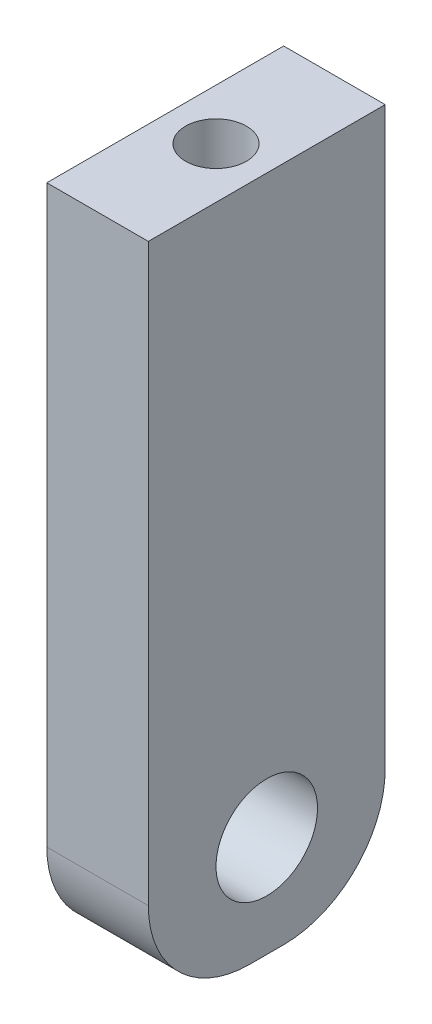
ISO-10303-21;
HEADER;
FILE_DESCRIPTION(('STEP AP214'),'2;1');
FILE_NAME('part.step','',(''),(''),'','','');
FILE_SCHEMA(('AUTOMOTIVE_DESIGN { 1 0 10303 214 1 1 1 1 }'));
ENDSEC;
DATA;
#1=APPLICATION_CONTEXT('core data for automotive mechanical design processes');
#2=APPLICATION_PROTOCOL_DEFINITION('international standard','automotive_design',2000,#1);
#3=PRODUCT_CONTEXT('',#1,'mechanical');
#4=PRODUCT('Part','Part','',(#3));
#5=PRODUCT_RELATED_PRODUCT_CATEGORY('part','',(#4));
#6=PRODUCT_DEFINITION_FORMATION('','',#4);
#7=PRODUCT_DEFINITION_CONTEXT('part definition',#1,'design');
#8=PRODUCT_DEFINITION('design','',#6,#7);
#9=PRODUCT_DEFINITION_SHAPE('','',#8);
#10=(LENGTH_UNIT() NAMED_UNIT(*) SI_UNIT(.MILLI.,.METRE.));
#11=(NAMED_UNIT(*) PLANE_ANGLE_UNIT() SI_UNIT($,.RADIAN.));
#12=(NAMED_UNIT(*) SI_UNIT($,.STERADIAN.) SOLID_ANGLE_UNIT());
#13=UNCERTAINTY_MEASURE_WITH_UNIT(LENGTH_MEASURE(1.E-05),#10,'distance_accuracy_value','');
#14=(GEOMETRIC_REPRESENTATION_CONTEXT(3) GLOBAL_UNCERTAINTY_ASSIGNED_CONTEXT((#13)) GLOBAL_UNIT_ASSIGNED_CONTEXT((#10,
#11,#12)) REPRESENTATION_CONTEXT('',''));
#15=CARTESIAN_POINT('',(0.,0.,0.));
#16=DIRECTION('',(0.,0.,1.));
#17=DIRECTION('',(1.,0.,0.));
#18=AXIS2_PLACEMENT_3D('',#15,#16,#17);
#19=CARTESIAN_POINT('',(3.,0.546254549383258,7.));
#20=DIRECTION('',(0.,-1.,0.));
#21=DIRECTION('',(1.,0.,0.));
#22=AXIS2_PLACEMENT_3D('',#19,#20,#21);
#23=PLANE('',#22);
#24=CARTESIAN_POINT('',(1.5,0.546254549383257,3.5));
#25=DIRECTION('',(0.,1.,0.));
#26=DIRECTION('',(-1.,0.,0.));
#27=AXIS2_PLACEMENT_3D('',#24,#25,#26);
#28=CIRCLE('',#27,0.9);
#29=CARTESIAN_POINT('',(0.6,0.546254549383257,3.5));
#30=VERTEX_POINT('',#29);
#31=EDGE_CURVE('E193',#30,#30,#28,.T.);
#32=ORIENTED_EDGE('',*,*,#31,.F.);
#33=EDGE_LOOP('',(#32));
#34=FACE_BOUND('',#33,.T.);
#35=DIRECTION('',(-1.,0.,0.));
#36=VECTOR('',#35,1.);
#37=CARTESIAN_POINT('',(3.,0.546254549383258,0.));
#38=LINE('',#37,#36);
#39=CARTESIAN_POINT('',(3.,0.546254549383258,0.));
#40=VERTEX_POINT('',#39);
#41=CARTESIAN_POINT('',(0.,0.546254549383257,0.));
#42=VERTEX_POINT('',#41);
#43=EDGE_CURVE('E115',#40,#42,#38,.T.);
#44=ORIENTED_EDGE('',*,*,#43,.T.);
#45=DIRECTION('',(0.,0.,-1.));
#46=VECTOR('',#45,1.);
#47=CARTESIAN_POINT('',(0.,0.546254549383257,7.));
#48=LINE('',#47,#46);
#49=CARTESIAN_POINT('',(0.,0.546254549383257,7.));
#50=VERTEX_POINT('',#49);
#51=EDGE_CURVE('E97',#50,#42,#48,.T.);
#52=ORIENTED_EDGE('',*,*,#51,.F.);
#53=DIRECTION('',(-1.,0.,0.));
#54=VECTOR('',#53,1.);
#55=CARTESIAN_POINT('',(3.,0.546254549383258,7.));
#56=LINE('',#55,#54);
#57=CARTESIAN_POINT('',(3.,0.546254549383258,7.));
#58=VERTEX_POINT('',#57);
#59=EDGE_CURVE('E104',#58,#50,#56,.T.);
#60=ORIENTED_EDGE('',*,*,#59,.F.);
#61=DIRECTION('',(0.,0.,-1.));
#62=VECTOR('',#61,1.);
#63=CARTESIAN_POINT('',(3.,0.546254549383258,7.));
#64=LINE('',#63,#62);
#65=EDGE_CURVE('E143',#58,#40,#64,.T.);
#66=ORIENTED_EDGE('',*,*,#65,.T.);
#67=EDGE_LOOP('',(#44,#52,#60,#66));
#68=FACE_BOUND('',#67,.T.);
#69=ADVANCED_FACE('F41',(#34,#68),#23,.F.);
#70=CARTESIAN_POINT('',(0.,0.546254549383257,7.));
#71=DIRECTION('',(1.,0.,0.));
#72=DIRECTION('',(0.,1.,0.));
#73=AXIS2_PLACEMENT_3D('',#70,#71,#72);
#74=PLANE('',#73);
#75=CARTESIAN_POINT('',(0.,-16.4537454506167,3.5));
#76=DIRECTION('',(1.,0.,0.));
#77=DIRECTION('',(0.,0.,-1.));
#78=AXIS2_PLACEMENT_3D('',#75,#76,#77);
#79=CIRCLE('',#78,1.5);
#80=CARTESIAN_POINT('',(0.,-16.4537454506167,2.));
#81=VERTEX_POINT('',#80);
#82=EDGE_CURVE('E149',#81,#81,#79,.T.);
#83=ORIENTED_EDGE('',*,*,#82,.T.);
#84=EDGE_LOOP('',(#83));
#85=FACE_BOUND('',#84,.T.);
#86=DIRECTION('',(0.,0.,-1.));
#87=VECTOR('',#86,1.);
#88=CARTESIAN_POINT('',(0.,-19.4537454506167,7.));
#89=LINE('',#88,#87);
#90=CARTESIAN_POINT('',(0.,-19.4537454506167,4.));
#91=VERTEX_POINT('',#90);
#92=CARTESIAN_POINT('',(0.,-19.4537454506167,3.));
#93=VERTEX_POINT('',#92);
#94=EDGE_CURVE('E117',#91,#93,#89,.T.);
#95=ORIENTED_EDGE('',*,*,#94,.F.);
#96=CARTESIAN_POINT('',(0.,-16.4537454506167,4.));
#97=DIRECTION('',(1.,0.,0.));
#98=DIRECTION('',(0.,1.,0.));
#99=AXIS2_PLACEMENT_3D('',#96,#97,#98);
#100=CIRCLE('',#99,3.);
#101=CARTESIAN_POINT('',(0.,-16.4537454506167,7.));
#102=VERTEX_POINT('',#101);
#103=EDGE_CURVE('E49',#91,#102,#100,.F.);
#104=ORIENTED_EDGE('',*,*,#103,.T.);
#105=DIRECTION('',(0.,-1.,0.));
#106=VECTOR('',#105,1.);
#107=CARTESIAN_POINT('',(0.,0.546254549383257,7.));
#108=LINE('',#107,#106);
#109=EDGE_CURVE('E93',#50,#102,#108,.T.);
#110=ORIENTED_EDGE('',*,*,#109,.F.);
#111=ORIENTED_EDGE('',*,*,#51,.T.);
#112=DIRECTION('',(0.,-1.,0.));
#113=VECTOR('',#112,1.);
#114=CARTESIAN_POINT('',(0.,0.546254549383257,0.));
#115=LINE('',#114,#113);
#116=CARTESIAN_POINT('',(0.,-16.4537454506167,0.));
#117=VERTEX_POINT('',#116);
#118=EDGE_CURVE('E148',#42,#117,#115,.T.);
#119=ORIENTED_EDGE('',*,*,#118,.T.);
#120=CARTESIAN_POINT('',(0.,-16.4537454506167,3.));
#121=DIRECTION('',(1.,0.,0.));
#122=DIRECTION('',(0.,1.,0.));
#123=AXIS2_PLACEMENT_3D('',#120,#121,#122);
#124=CIRCLE('',#123,3.);
#125=EDGE_CURVE('E61',#117,#93,#124,.F.);
#126=ORIENTED_EDGE('',*,*,#125,.T.);
#127=EDGE_LOOP('',(#95,#104,#110,#111,#119,#126));
#128=FACE_BOUND('',#127,.T.);
#129=ADVANCED_FACE('F95',(#85,#128),#74,.F.);
#130=CARTESIAN_POINT('',(0.,-19.4537454506167,7.));
#131=DIRECTION('',(0.,1.,0.));
#132=DIRECTION('',(0.,0.,1.));
#133=AXIS2_PLACEMENT_3D('',#130,#131,#132);
#134=PLANE('',#133);
#135=DIRECTION('',(0.,0.,-1.));
#136=VECTOR('',#135,1.);
#137=CARTESIAN_POINT('',(3.,-19.4537454506167,7.));
#138=LINE('',#137,#136);
#139=CARTESIAN_POINT('',(3.,-19.4537454506167,4.));
#140=VERTEX_POINT('',#139);
#141=CARTESIAN_POINT('',(3.,-19.4537454506167,3.));
#142=VERTEX_POINT('',#141);
#143=EDGE_CURVE('E121',#140,#142,#138,.T.);
#144=ORIENTED_EDGE('',*,*,#143,.F.);
#145=DIRECTION('',(1.,0.,0.));
#146=VECTOR('',#145,1.);
#147=CARTESIAN_POINT('',(0.,-19.4537454506167,4.));
#148=LINE('',#147,#146);
#149=EDGE_CURVE('E131',#140,#91,#148,.F.);
#150=ORIENTED_EDGE('',*,*,#149,.T.);
#151=ORIENTED_EDGE('',*,*,#94,.T.);
#152=DIRECTION('',(1.,0.,0.));
#153=VECTOR('',#152,1.);
#154=CARTESIAN_POINT('',(0.,-19.4537454506167,3.));
#155=LINE('',#154,#153);
#156=EDGE_CURVE('E128',#93,#142,#155,.T.);
#157=ORIENTED_EDGE('',*,*,#156,.T.);
#158=EDGE_LOOP('',(#144,#150,#151,#157));
#159=FACE_BOUND('',#158,.T.);
#160=ADVANCED_FACE('F136',(#159),#134,.F.);
#161=CARTESIAN_POINT('',(3.,-19.4537454506167,7.));
#162=DIRECTION('',(-1.,0.,0.));
#163=DIRECTION('',(0.,0.,1.));
#164=AXIS2_PLACEMENT_3D('',#161,#162,#163);
#165=PLANE('',#164);
#166=CARTESIAN_POINT('',(3.,-16.4537454506167,3.5));
#167=DIRECTION('',(1.,0.,0.));
#168=DIRECTION('',(0.,0.,-1.));
#169=AXIS2_PLACEMENT_3D('',#166,#167,#168);
#170=CIRCLE('',#169,1.5);
#171=CARTESIAN_POINT('',(3.,-16.4537454506167,2.));
#172=VERTEX_POINT('',#171);
#173=EDGE_CURVE('E192',#172,#172,#170,.T.);
#174=ORIENTED_EDGE('',*,*,#173,.F.);
#175=EDGE_LOOP('',(#174));
#176=FACE_BOUND('',#175,.T.);
#177=DIRECTION('',(0.,1.,0.));
#178=VECTOR('',#177,1.);
#179=CARTESIAN_POINT('',(3.,-19.4537454506167,7.));
#180=LINE('',#179,#178);
#181=CARTESIAN_POINT('',(3.,-16.4537454506167,7.));
#182=VERTEX_POINT('',#181);
#183=EDGE_CURVE('E103',#182,#58,#180,.T.);
#184=ORIENTED_EDGE('',*,*,#183,.F.);
#185=CARTESIAN_POINT('',(3.,-16.4537454506167,4.));
#186=DIRECTION('',(-1.,0.,0.));
#187=DIRECTION('',(0.,0.,1.));
#188=AXIS2_PLACEMENT_3D('',#185,#186,#187);
#189=CIRCLE('',#188,3.);
#190=EDGE_CURVE('E126',#182,#140,#189,.F.);
#191=ORIENTED_EDGE('',*,*,#190,.T.);
#192=ORIENTED_EDGE('',*,*,#143,.T.);
#193=CARTESIAN_POINT('',(3.,-16.4537454506167,3.));
#194=DIRECTION('',(-1.,0.,0.));
#195=DIRECTION('',(0.,0.,1.));
#196=AXIS2_PLACEMENT_3D('',#193,#194,#195);
#197=CIRCLE('',#196,3.);
#198=CARTESIAN_POINT('',(3.,-16.4537454506167,0.));
#199=VERTEX_POINT('',#198);
#200=EDGE_CURVE('E119',#142,#199,#197,.F.);
#201=ORIENTED_EDGE('',*,*,#200,.T.);
#202=DIRECTION('',(0.,1.,0.));
#203=VECTOR('',#202,1.);
#204=CARTESIAN_POINT('',(3.,-19.4537454506167,0.));
#205=LINE('',#204,#203);
#206=EDGE_CURVE('E112',#199,#40,#205,.T.);
#207=ORIENTED_EDGE('',*,*,#206,.T.);
#208=ORIENTED_EDGE('',*,*,#65,.F.);
#209=EDGE_LOOP('',(#184,#191,#192,#201,#207,#208));
#210=FACE_BOUND('',#209,.T.);
#211=ADVANCED_FACE('F142',(#176,#210),#165,.F.);
#212=CARTESIAN_POINT('',(0.,0.,7.));
#213=DIRECTION('',(0.,0.,1.));
#214=DIRECTION('',(1.,0.,0.));
#215=AXIS2_PLACEMENT_3D('',#212,#213,#214);
#216=PLANE('',#215);
#217=ORIENTED_EDGE('',*,*,#109,.T.);
#218=DIRECTION('',(1.,0.,0.));
#219=VECTOR('',#218,1.);
#220=CARTESIAN_POINT('',(3.,-16.4537454506167,7.));
#221=LINE('',#220,#219);
#222=EDGE_CURVE('E116',#102,#182,#221,.T.);
#223=ORIENTED_EDGE('',*,*,#222,.T.);
#224=ORIENTED_EDGE('',*,*,#183,.T.);
#225=ORIENTED_EDGE('',*,*,#59,.T.);
#226=EDGE_LOOP('',(#217,#223,#224,#225));
#227=FACE_BOUND('',#226,.T.);
#228=ADVANCED_FACE('F107',(#227),#216,.T.);
#229=CARTESIAN_POINT('',(0.,0.,0.));
#230=DIRECTION('',(0.,0.,1.));
#231=DIRECTION('',(1.,0.,0.));
#232=AXIS2_PLACEMENT_3D('',#229,#230,#231);
#233=PLANE('',#232);
#234=ORIENTED_EDGE('',*,*,#206,.F.);
#235=DIRECTION('',(1.,0.,0.));
#236=VECTOR('',#235,1.);
#237=CARTESIAN_POINT('',(0.,-16.4537454506167,0.));
#238=LINE('',#237,#236);
#239=EDGE_CURVE('E11',#199,#117,#238,.F.);
#240=ORIENTED_EDGE('',*,*,#239,.T.);
#241=ORIENTED_EDGE('',*,*,#118,.F.);
#242=ORIENTED_EDGE('',*,*,#43,.F.);
#243=EDGE_LOOP('',(#234,#240,#241,#242));
#244=FACE_BOUND('',#243,.T.);
#245=ADVANCED_FACE('F152',(#244),#233,.F.);
#246=CARTESIAN_POINT('',(0.,-16.4537454506167,3.5));
#247=DIRECTION('',(1.,0.,0.));
#248=DIRECTION('',(0.,0.,-1.));
#249=AXIS2_PLACEMENT_3D('',#246,#247,#248);
#250=CYLINDRICAL_SURFACE('',#249,1.5);
#251=CARTESIAN_POINT('',(0.,-16.4537454506167,2.));
#252=CARTESIAN_POINT('',(0.0312499999999995,-16.4537454506167,2.));
#253=CARTESIAN_POINT('',(0.0624999999999996,-16.4537454506167,2.));
#254=CARTESIAN_POINT('',(0.125,-16.4537454506167,2.));
#255=CARTESIAN_POINT('',(0.15625,-16.4537454506167,2.));
#256=CARTESIAN_POINT('',(0.21875,-16.4537454506167,2.));
#257=CARTESIAN_POINT('',(0.25,-16.4537454506167,2.));
#258=CARTESIAN_POINT('',(0.3125,-16.4537454506167,2.));
#259=CARTESIAN_POINT('',(0.34375,-16.4537454506167,2.));
#260=CARTESIAN_POINT('',(0.40625,-16.4537454506167,2.));
#261=CARTESIAN_POINT('',(0.4375,-16.4537454506167,2.));
#262=CARTESIAN_POINT('',(0.5,-16.4537454506167,2.));
#263=CARTESIAN_POINT('',(0.53125,-16.4537454506167,2.));
#264=CARTESIAN_POINT('',(0.59375,-16.4537454506167,2.));
#265=CARTESIAN_POINT('',(0.625,-16.4537454506167,2.));
#266=CARTESIAN_POINT('',(0.6875,-16.4537454506167,2.));
#267=CARTESIAN_POINT('',(0.71875,-16.4537454506167,2.));
#268=CARTESIAN_POINT('',(0.78125,-16.4537454506167,2.));
#269=CARTESIAN_POINT('',(0.8125,-16.4537454506167,2.));
#270=CARTESIAN_POINT('',(0.875,-16.4537454506167,2.));
#271=CARTESIAN_POINT('',(0.90625,-16.4537454506167,2.));
#272=CARTESIAN_POINT('',(0.96875,-16.4537454506167,2.));
#273=CARTESIAN_POINT('',(1.,-16.4537454506167,2.));
#274=CARTESIAN_POINT('',(1.0625,-16.4537454506167,2.));
#275=CARTESIAN_POINT('',(1.09375,-16.4537454506167,2.));
#276=CARTESIAN_POINT('',(1.15625,-16.4537454506167,2.));
#277=CARTESIAN_POINT('',(1.1875,-16.4537454506167,2.));
#278=CARTESIAN_POINT('',(1.25,-16.4537454506167,2.));
#279=CARTESIAN_POINT('',(1.28125,-16.4537454506167,2.));
#280=CARTESIAN_POINT('',(1.34375,-16.4537454506167,2.));
#281=CARTESIAN_POINT('',(1.375,-16.4537454506167,2.));
#282=CARTESIAN_POINT('',(1.4375,-16.4537454506167,2.));
#283=CARTESIAN_POINT('',(1.46875,-16.4537454506167,2.));
#284=CARTESIAN_POINT('',(1.53125,-16.4537454506167,2.));
#285=CARTESIAN_POINT('',(1.5625,-16.4537454506167,2.));
#286=CARTESIAN_POINT('',(1.625,-16.4537454506167,2.));
#287=CARTESIAN_POINT('',(1.65625,-16.4537454506167,2.));
#288=CARTESIAN_POINT('',(1.71875,-16.4537454506167,2.));
#289=CARTESIAN_POINT('',(1.75,-16.4537454506167,2.));
#290=CARTESIAN_POINT('',(1.8125,-16.4537454506167,2.));
#291=CARTESIAN_POINT('',(1.84375,-16.4537454506167,2.));
#292=CARTESIAN_POINT('',(1.90625,-16.4537454506167,2.));
#293=CARTESIAN_POINT('',(1.9375,-16.4537454506167,2.));
#294=CARTESIAN_POINT('',(2.,-16.4537454506167,2.));
#295=CARTESIAN_POINT('',(2.03125,-16.4537454506167,2.));
#296=CARTESIAN_POINT('',(2.09375,-16.4537454506167,2.));
#297=CARTESIAN_POINT('',(2.125,-16.4537454506167,2.));
#298=CARTESIAN_POINT('',(2.1875,-16.4537454506167,2.));
#299=CARTESIAN_POINT('',(2.21875,-16.4537454506167,2.));
#300=CARTESIAN_POINT('',(2.28125,-16.4537454506167,2.));
#301=CARTESIAN_POINT('',(2.3125,-16.4537454506167,2.));
#302=CARTESIAN_POINT('',(2.375,-16.4537454506167,2.));
#303=CARTESIAN_POINT('',(2.40625,-16.4537454506167,2.));
#304=CARTESIAN_POINT('',(2.46875,-16.4537454506167,2.));
#305=CARTESIAN_POINT('',(2.5,-16.4537454506167,2.));
#306=CARTESIAN_POINT('',(2.5625,-16.4537454506167,2.));
#307=CARTESIAN_POINT('',(2.59375,-16.4537454506167,2.));
#308=CARTESIAN_POINT('',(2.65625,-16.4537454506167,2.));
#309=CARTESIAN_POINT('',(2.6875,-16.4537454506167,2.));
#310=CARTESIAN_POINT('',(2.75,-16.4537454506167,2.));
#311=CARTESIAN_POINT('',(2.78125,-16.4537454506167,2.));
#312=CARTESIAN_POINT('',(2.84375,-16.4537454506167,2.));
#313=CARTESIAN_POINT('',(2.875,-16.4537454506167,2.));
#314=CARTESIAN_POINT('',(2.9375,-16.4537454506167,2.));
#315=CARTESIAN_POINT('',(2.96875,-16.4537454506167,2.));
#316=CARTESIAN_POINT('',(3.,-16.4537454506167,2.));
#317=B_SPLINE_CURVE_WITH_KNOTS('',3,(#251,#252,#253,#254,#255,#256,#257,#258,#259,#260,#261,
#262,#263,#264,#265,#266,#267,#268,#269,#270,#271,#272,#273,#274,#275,#276,#277,#278,#279,#280,
#281,#282,#283,#284,#285,#286,#287,#288,#289,#290,#291,#292,#293,#294,#295,#296,#297,#298,#299,
#300,#301,#302,#303,#304,#305,#306,#307,#308,#309,#310,#311,#312,#313,#314,#315,#316),
.UNSPECIFIED.,.F.,.F.,(4,2,2,2,2,2,2,2,2,2,2,2,2,2,2,2,2,2,2,2,2,2,2,2,2,2,2,2,2,2,2,2,4),(0.,
0.09375,0.1875,0.28125,0.375,0.46875,0.5625,0.65625,0.75,0.84375,0.9375,1.03125,1.125,1.21875,
1.3125,1.40625,1.5,1.59375,1.6875,1.78125,1.875,1.96875,2.0625,2.15625,2.25,2.34375,2.4375,
2.53125,2.625,2.71875,2.8125,2.90625,3.),.UNSPECIFIED.);
#318=EDGE_CURVE('BSEAM163',#81,#172,#317,.T.);
#319=ORIENTED_EDGE('',*,*,#82,.F.);
#320=ORIENTED_EDGE('',*,*,#173,.T.);
#321=ORIENTED_EDGE('',*,*,#318,.T.);
#322=ORIENTED_EDGE('',*,*,#318,.F.);
#323=EDGE_LOOP('',(#319,#321,#320,#322));
#324=FACE_BOUND('',#323,.T.);
#325=ADVANCED_FACE('F163',(#324),#250,.F.);
#326=CARTESIAN_POINT('',(0.,-16.4537454506167,4.));
#327=DIRECTION('',(-1.,0.,0.));
#328=DIRECTION('',(0.,0.,1.));
#329=AXIS2_PLACEMENT_3D('',#326,#327,#328);
#330=CYLINDRICAL_SURFACE('',#329,3.);
#331=ORIENTED_EDGE('',*,*,#103,.F.);
#332=ORIENTED_EDGE('',*,*,#149,.F.);
#333=ORIENTED_EDGE('',*,*,#190,.F.);
#334=ORIENTED_EDGE('',*,*,#222,.F.);
#335=EDGE_LOOP('',(#331,#332,#333,#334));
#336=FACE_BOUND('',#335,.T.);
#337=ADVANCED_FACE('F140',(#336),#330,.T.);
#338=CARTESIAN_POINT('',(0.,-16.4537454506167,3.));
#339=DIRECTION('',(1.,0.,0.));
#340=DIRECTION('',(0.,0.,-1.));
#341=AXIS2_PLACEMENT_3D('',#338,#339,#340);
#342=CYLINDRICAL_SURFACE('',#341,3.);
#343=ORIENTED_EDGE('',*,*,#125,.F.);
#344=ORIENTED_EDGE('',*,*,#239,.F.);
#345=ORIENTED_EDGE('',*,*,#200,.F.);
#346=ORIENTED_EDGE('',*,*,#156,.F.);
#347=EDGE_LOOP('',(#343,#344,#345,#346));
#348=FACE_BOUND('',#347,.T.);
#349=ADVANCED_FACE('F43',(#348),#342,.T.);
#350=CARTESIAN_POINT('',(1.5,-6.45374545061674,3.5));
#351=DIRECTION('',(0.,1.,0.));
#352=DIRECTION('',(-1.,0.,0.));
#353=AXIS2_PLACEMENT_3D('',#350,#351,#352);
#354=CYLINDRICAL_SURFACE('',#353,0.9);
#355=CARTESIAN_POINT('',(1.5,-6.45374545061674,3.5));
#356=DIRECTION('',(0.,1.,0.));
#357=DIRECTION('',(-1.,0.,0.));
#358=AXIS2_PLACEMENT_3D('',#355,#356,#357);
#359=CIRCLE('',#358,0.9);
#360=CARTESIAN_POINT('',(0.600000000000001,-6.45374545061674,3.5));
#361=VERTEX_POINT('',#360);
#362=EDGE_CURVE('E191',#361,#361,#359,.T.);
#363=ORIENTED_EDGE('',*,*,#362,.F.);
#364=EDGE_LOOP('',(#363));
#365=FACE_BOUND('',#364,.T.);
#366=ORIENTED_EDGE('',*,*,#31,.T.);
#367=EDGE_LOOP('',(#366));
#368=FACE_BOUND('',#367,.T.);
#369=ADVANCED_FACE('F154',(#365,#368),#354,.F.);
#370=CARTESIAN_POINT('',(1.5,-6.45374545061674,3.5));
#371=DIRECTION('',(0.,1.,0.));
#372=DIRECTION('',(-1.,0.,0.));
#373=AXIS2_PLACEMENT_3D('',#370,#371,#372);
#374=PLANE('',#373);
#375=ORIENTED_EDGE('',*,*,#362,.T.);
#376=EDGE_LOOP('',(#375));
#377=FACE_BOUND('',#376,.T.);
#378=ADVANCED_FACE('F160',(#377),#374,.T.);
#379=CLOSED_SHELL('',(#69,#129,#160,#211,#228,#245,#325,#337,#349,#369,#378));
#380=MANIFOLD_SOLID_BREP('B2',#379);
#381=ADVANCED_BREP_SHAPE_REPRESENTATION('',(#18,#380),#14);
#382=SHAPE_DEFINITION_REPRESENTATION(#9,#381);
ENDSEC;
END-ISO-10303-21;
